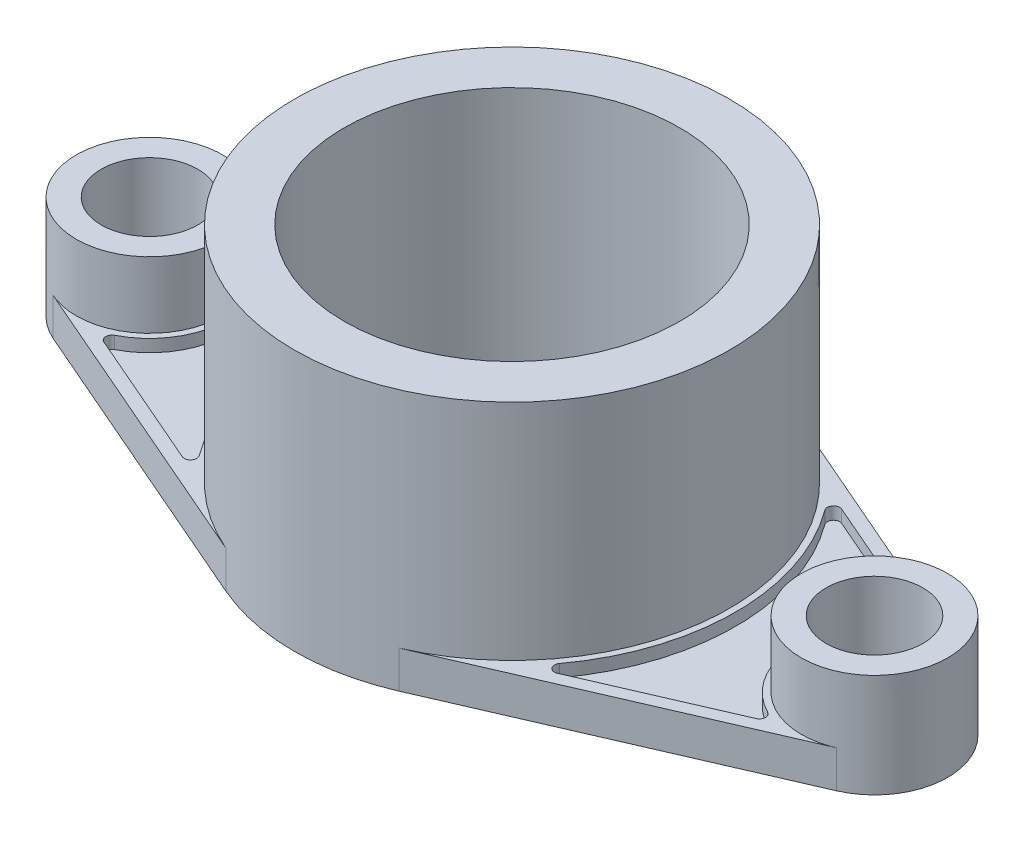
ISO-10303-21;
HEADER;
FILE_DESCRIPTION(('STEP AP214'),'2;1');
FILE_NAME('part.step','',(''),(''),'','','');
FILE_SCHEMA(('AUTOMOTIVE_DESIGN { 1 0 10303 214 1 1 1 1 }'));
ENDSEC;
DATA;
#1=APPLICATION_CONTEXT('core data for automotive mechanical design processes');
#2=APPLICATION_PROTOCOL_DEFINITION('international standard','automotive_design',2000,#1);
#3=PRODUCT_CONTEXT('',#1,'mechanical');
#4=PRODUCT('Part','Part','',(#3));
#5=PRODUCT_RELATED_PRODUCT_CATEGORY('part','',(#4));
#6=PRODUCT_DEFINITION_FORMATION('','',#4);
#7=PRODUCT_DEFINITION_CONTEXT('part definition',#1,'design');
#8=PRODUCT_DEFINITION('design','',#6,#7);
#9=PRODUCT_DEFINITION_SHAPE('','',#8);
#10=(LENGTH_UNIT() NAMED_UNIT(*) SI_UNIT(.MILLI.,.METRE.));
#11=(NAMED_UNIT(*) PLANE_ANGLE_UNIT() SI_UNIT($,.RADIAN.));
#12=(NAMED_UNIT(*) SI_UNIT($,.STERADIAN.) SOLID_ANGLE_UNIT());
#13=UNCERTAINTY_MEASURE_WITH_UNIT(LENGTH_MEASURE(1.E-05),#10,'distance_accuracy_value','');
#14=(GEOMETRIC_REPRESENTATION_CONTEXT(3) GLOBAL_UNCERTAINTY_ASSIGNED_CONTEXT((#13)) GLOBAL_UNIT_ASSIGNED_CONTEXT((#10,
#11,#12)) REPRESENTATION_CONTEXT('',''));
#15=CARTESIAN_POINT('',(0.,0.,0.));
#16=DIRECTION('',(0.,0.,1.));
#17=DIRECTION('',(1.,0.,0.));
#18=AXIS2_PLACEMENT_3D('',#15,#16,#17);
#19=CARTESIAN_POINT('',(87.5,9.,0.));
#20=DIRECTION('',(0.,-1.,0.));
#21=DIRECTION('',(0.,0.,-1.));
#22=AXIS2_PLACEMENT_3D('',#19,#20,#21);
#23=PLANE('',#22);
#24=CARTESIAN_POINT('',(87.5,9.,0.));
#25=DIRECTION('',(0.,1.,0.));
#26=DIRECTION('',(0.,0.,-1.));
#27=AXIS2_PLACEMENT_3D('',#24,#25,#26);
#28=CIRCLE('',#27,17.665);
#29=CARTESIAN_POINT('',(94.5326888571428,9.,-16.204737345561));
#30=VERTEX_POINT('',#29);
#31=CARTESIAN_POINT('',(94.5326888571429,9.,16.2047373455609));
#32=VERTEX_POINT('',#31);
#33=EDGE_CURVE('E354',#30,#32,#28,.T.);
#34=ORIENTED_EDGE('',*,*,#33,.F.);
#35=DIRECTION('',(0.917335824826549,0.,0.398114285714285));
#36=VECTOR('',#35,1.);
#37=CARTESIAN_POINT('',(94.5326888571428,9.,-16.204737345561));
#38=LINE('',#37,#36);
#39=CARTESIAN_POINT('',(20.901,9.,-48.1601308033938));
#40=VERTEX_POINT('',#39);
#41=EDGE_CURVE('E363',#40,#30,#38,.T.);
#42=ORIENTED_EDGE('',*,*,#41,.F.);
#43=CARTESIAN_POINT('',(0.,9.,0.));
#44=DIRECTION('',(0.,1.,0.));
#45=DIRECTION('',(0.,0.,-1.));
#46=AXIS2_PLACEMENT_3D('',#43,#44,#45);
#47=CIRCLE('',#46,52.5);
#48=CARTESIAN_POINT('',(20.901,9.,48.1601308033938));
#49=VERTEX_POINT('',#48);
#50=EDGE_CURVE('E361',#49,#40,#47,.T.);
#51=ORIENTED_EDGE('',*,*,#50,.F.);
#52=DIRECTION('',(-0.917335824826548,0.,0.398114285714286));
#53=VECTOR('',#52,1.);
#54=CARTESIAN_POINT('',(94.5326888571429,9.,16.204737345561));
#55=LINE('',#54,#53);
#56=EDGE_CURVE('E357',#32,#49,#55,.T.);
#57=ORIENTED_EDGE('',*,*,#56,.F.);
#58=EDGE_LOOP('',(#34,#42,#51,#57));
#59=FACE_BOUND('',#58,.T.);
#60=CARTESIAN_POINT('',(87.5,9.,0.));
#61=DIRECTION('',(0.,-1.,0.));
#62=DIRECTION('',(0.,0.,-1.));
#63=AXIS2_PLACEMENT_3D('',#60,#61,#62);
#64=CIRCLE('',#63,19.165);
#65=CARTESIAN_POINT('',(78.8093599511355,9.,-17.0812763147568));
#66=VERTEX_POINT('',#65);
#67=CARTESIAN_POINT('',(78.8093599511355,9.,17.0812763147568));
#68=VERTEX_POINT('',#67);
#69=EDGE_CURVE('E414',#66,#68,#64,.F.);
#70=ORIENTED_EDGE('',*,*,#69,.T.);
#71=CARTESIAN_POINT('',(78.1291637563379,9.,18.4181881056327));
#72=DIRECTION('',(0.,-1.,0.));
#73=DIRECTION('',(0.,0.,-1.));
#74=AXIS2_PLACEMENT_3D('',#71,#72,#73);
#75=CIRCLE('',#74,1.5);
#76=CARTESIAN_POINT('',(78.7263351849093,9.,19.7941918428725));
#77=VERTEX_POINT('',#76);
#78=EDGE_CURVE('E11',#68,#77,#75,.T.);
#79=ORIENTED_EDGE('',*,*,#78,.T.);
#80=DIRECTION('',(-0.917335824826549,0.,0.398114285714286));
#81=VECTOR('',#80,1.);
#82=CARTESIAN_POINT('',(93.338346,9.,13.4527298710813));
#83=LINE('',#82,#81);
#84=CARTESIAN_POINT('',(45.2647922135112,9.,34.316156338781));
#85=VERTEX_POINT('',#84);
#86=EDGE_CURVE('E47',#77,#85,#83,.T.);
#87=ORIENTED_EDGE('',*,*,#86,.T.);
#88=CARTESIAN_POINT('',(44.6676207849397,9.,32.9401526015412));
#89=DIRECTION('',(0.,-1.,0.));
#90=DIRECTION('',(0.,0.,-1.));
#91=AXIS2_PLACEMENT_3D('',#88,#89,#90);
#92=CIRCLE('',#91,1.5);
#93=CARTESIAN_POINT('',(43.4603877907522,9.,32.0498782069049));
#94=VERTEX_POINT('',#93);
#95=EDGE_CURVE('E429',#85,#94,#92,.T.);
#96=ORIENTED_EDGE('',*,*,#95,.T.);
#97=CARTESIAN_POINT('',(0.,9.,0.));
#98=DIRECTION('',(0.,-1.,0.));
#99=DIRECTION('',(0.,0.,-1.));
#100=AXIS2_PLACEMENT_3D('',#97,#98,#99);
#101=CIRCLE('',#100,54.);
#102=CARTESIAN_POINT('',(43.4603877907522,9.,-32.0498782069049));
#103=VERTEX_POINT('',#102);
#104=EDGE_CURVE('E426',#94,#103,#101,.F.);
#105=ORIENTED_EDGE('',*,*,#104,.T.);
#106=CARTESIAN_POINT('',(44.6676207849397,9.,-32.9401526015412));
#107=DIRECTION('',(0.,-1.,0.));
#108=DIRECTION('',(0.,0.,-1.));
#109=AXIS2_PLACEMENT_3D('',#106,#107,#108);
#110=CIRCLE('',#109,1.5);
#111=CARTESIAN_POINT('',(45.2647922135112,9.,-34.316156338781));
#112=VERTEX_POINT('',#111);
#113=EDGE_CURVE('E423',#103,#112,#110,.T.);
#114=ORIENTED_EDGE('',*,*,#113,.T.);
#115=DIRECTION('',(0.917335824826549,0.,0.398114285714286));
#116=VECTOR('',#115,1.);
#117=CARTESIAN_POINT('',(93.338346,9.,-13.4527298710813));
#118=LINE('',#117,#116);
#119=CARTESIAN_POINT('',(78.7263351849093,9.,-19.7941918428725));
#120=VERTEX_POINT('',#119);
#121=EDGE_CURVE('E420',#112,#120,#118,.T.);
#122=ORIENTED_EDGE('',*,*,#121,.T.);
#123=CARTESIAN_POINT('',(78.1291637563379,9.,-18.4181881056327));
#124=DIRECTION('',(0.,-1.,0.));
#125=DIRECTION('',(0.,0.,-1.));
#126=AXIS2_PLACEMENT_3D('',#123,#124,#125);
#127=CIRCLE('',#126,1.5);
#128=EDGE_CURVE('E417',#120,#66,#127,.T.);
#129=ORIENTED_EDGE('',*,*,#128,.T.);
#130=EDGE_LOOP('',(#70,#79,#87,#96,#105,#114,#122,#129));
#131=FACE_BOUND('',#130,.T.);
#132=ADVANCED_FACE('F39',(#59,#131),#23,.F.);
#133=CARTESIAN_POINT('',(0.,63.,0.));
#134=DIRECTION('',(0.,1.,0.));
#135=DIRECTION('',(0.,0.,1.));
#136=AXIS2_PLACEMENT_3D('',#133,#134,#135);
#137=PLANE('',#136);
#138=CARTESIAN_POINT('',(0.,63.,0.));
#139=DIRECTION('',(0.,1.,0.));
#140=DIRECTION('',(0.,0.,1.));
#141=AXIS2_PLACEMENT_3D('',#138,#139,#140);
#142=CIRCLE('',#141,52.5);
#143=CARTESIAN_POINT('',(0.,63.,52.5));
#144=VERTEX_POINT('',#143);
#145=EDGE_CURVE('E388',#144,#144,#142,.T.);
#146=ORIENTED_EDGE('',*,*,#145,.T.);
#147=EDGE_LOOP('',(#146));
#148=FACE_BOUND('',#147,.T.);
#149=CARTESIAN_POINT('',(0.,63.,0.));
#150=DIRECTION('',(0.,1.,0.));
#151=DIRECTION('',(0.,0.,1.));
#152=AXIS2_PLACEMENT_3D('',#149,#150,#151);
#153=CIRCLE('',#152,40.5);
#154=CARTESIAN_POINT('',(0.,63.,40.5));
#155=VERTEX_POINT('',#154);
#156=EDGE_CURVE('E382',#155,#155,#153,.T.);
#157=ORIENTED_EDGE('',*,*,#156,.F.);
#158=EDGE_LOOP('',(#157));
#159=FACE_BOUND('',#158,.T.);
#160=ADVANCED_FACE('F467',(#148,#159),#137,.T.);
#161=CARTESIAN_POINT('',(0.,0.,0.));
#162=DIRECTION('',(0.,1.,0.));
#163=DIRECTION('',(0.,0.,1.));
#164=AXIS2_PLACEMENT_3D('',#161,#162,#163);
#165=PLANE('',#164);
#166=CARTESIAN_POINT('',(0.,0.,0.));
#167=DIRECTION('',(0.,1.,0.));
#168=DIRECTION('',(0.,0.,1.));
#169=AXIS2_PLACEMENT_3D('',#166,#167,#168);
#170=CIRCLE('',#169,52.5);
#171=CARTESIAN_POINT('',(20.901,0.,-48.1601308033938));
#172=VERTEX_POINT('',#171);
#173=CARTESIAN_POINT('',(-20.901,0.,-48.1601308033938));
#174=VERTEX_POINT('',#173);
#175=EDGE_CURVE('E392',#172,#174,#170,.T.);
#176=ORIENTED_EDGE('',*,*,#175,.F.);
#177=DIRECTION('',(0.917335824826549,0.,0.398114285714285));
#178=VECTOR('',#177,1.);
#179=CARTESIAN_POINT('',(94.5326888571428,0.,-16.204737345561));
#180=LINE('',#179,#178);
#181=CARTESIAN_POINT('',(94.5326888571428,0.,-16.204737345561));
#182=VERTEX_POINT('',#181);
#183=EDGE_CURVE('E358',#172,#182,#180,.T.);
#184=ORIENTED_EDGE('',*,*,#183,.T.);
#185=CARTESIAN_POINT('',(87.5,0.,0.));
#186=DIRECTION('',(0.,1.,0.));
#187=DIRECTION('',(0.,0.,1.));
#188=AXIS2_PLACEMENT_3D('',#185,#186,#187);
#189=CIRCLE('',#188,17.665);
#190=CARTESIAN_POINT('',(94.5326888571429,0.,16.204737345561));
#191=VERTEX_POINT('',#190);
#192=EDGE_CURVE('E348',#191,#182,#189,.T.);
#193=ORIENTED_EDGE('',*,*,#192,.F.);
#194=DIRECTION('',(-0.917335824826548,0.,0.398114285714286));
#195=VECTOR('',#194,1.);
#196=CARTESIAN_POINT('',(94.5326888571429,0.,16.204737345561));
#197=LINE('',#196,#195);
#198=CARTESIAN_POINT('',(20.901,0.,48.1601308033938));
#199=VERTEX_POINT('',#198);
#200=EDGE_CURVE('E351',#191,#199,#197,.T.);
#201=ORIENTED_EDGE('',*,*,#200,.T.);
#202=CARTESIAN_POINT('',(-20.901,0.,48.1601308033938));
#203=VERTEX_POINT('',#202);
#204=EDGE_CURVE('E385',#203,#199,#170,.T.);
#205=ORIENTED_EDGE('',*,*,#204,.F.);
#206=DIRECTION('',(-0.917335824826549,0.,-0.398114285714286));
#207=VECTOR('',#206,1.);
#208=CARTESIAN_POINT('',(-94.5326888571429,0.,16.204737345561));
#209=LINE('',#208,#207);
#210=CARTESIAN_POINT('',(-94.5326888571429,0.,16.204737345561));
#211=VERTEX_POINT('',#210);
#212=EDGE_CURVE('E325',#203,#211,#209,.T.);
#213=ORIENTED_EDGE('',*,*,#212,.T.);
#214=CARTESIAN_POINT('',(-87.5,0.,0.));
#215=DIRECTION('',(0.,1.,0.));
#216=DIRECTION('',(0.,0.,1.));
#217=AXIS2_PLACEMENT_3D('',#214,#215,#216);
#218=CIRCLE('',#217,17.665);
#219=CARTESIAN_POINT('',(-94.5326888571428,0.,-16.204737345561));
#220=VERTEX_POINT('',#219);
#221=EDGE_CURVE('E243',#220,#211,#218,.T.);
#222=ORIENTED_EDGE('',*,*,#221,.F.);
#223=DIRECTION('',(0.917335824826548,0.,-0.398114285714286));
#224=VECTOR('',#223,1.);
#225=CARTESIAN_POINT('',(-20.901,0.,-48.1601308033938));
#226=LINE('',#225,#224);
#227=EDGE_CURVE('E328',#220,#174,#226,.T.);
#228=ORIENTED_EDGE('',*,*,#227,.T.);
#229=EDGE_LOOP('',(#176,#184,#193,#201,#205,#213,#222,#228));
#230=FACE_BOUND('',#229,.T.);
#231=CARTESIAN_POINT('',(0.,0.,0.));
#232=DIRECTION('',(0.,1.,0.));
#233=DIRECTION('',(0.,0.,1.));
#234=AXIS2_PLACEMENT_3D('',#231,#232,#233);
#235=CIRCLE('',#234,40.5);
#236=CARTESIAN_POINT('',(0.,0.,40.5));
#237=VERTEX_POINT('',#236);
#238=EDGE_CURVE('E373',#237,#237,#235,.T.);
#239=ORIENTED_EDGE('',*,*,#238,.T.);
#240=EDGE_LOOP('',(#239));
#241=FACE_BOUND('',#240,.T.);
#242=CARTESIAN_POINT('',(87.5,0.,0.));
#243=DIRECTION('',(0.,1.,0.));
#244=DIRECTION('',(0.,0.,1.));
#245=AXIS2_PLACEMENT_3D('',#242,#243,#244);
#246=CIRCLE('',#245,11.665);
#247=CARTESIAN_POINT('',(87.5,0.,11.665));
#248=VERTEX_POINT('',#247);
#249=EDGE_CURVE('E342',#248,#248,#246,.T.);
#250=ORIENTED_EDGE('',*,*,#249,.T.);
#251=EDGE_LOOP('',(#250));
#252=FACE_BOUND('',#251,.T.);
#253=CARTESIAN_POINT('',(-87.5,0.,0.));
#254=DIRECTION('',(0.,1.,0.));
#255=DIRECTION('',(0.,0.,1.));
#256=AXIS2_PLACEMENT_3D('',#253,#254,#255);
#257=CIRCLE('',#256,11.665);
#258=CARTESIAN_POINT('',(-87.5,0.,11.665));
#259=VERTEX_POINT('',#258);
#260=EDGE_CURVE('E305',#259,#259,#257,.T.);
#261=ORIENTED_EDGE('',*,*,#260,.T.);
#262=EDGE_LOOP('',(#261));
#263=FACE_BOUND('',#262,.T.);
#264=ADVANCED_FACE('F475',(#230,#241,#252,#263),#165,.F.);
#265=CARTESIAN_POINT('',(0.,63.,0.));
#266=DIRECTION('',(0.,-1.,0.));
#267=DIRECTION('',(0.,0.,-1.));
#268=AXIS2_PLACEMENT_3D('',#265,#266,#267);
#269=CYLINDRICAL_SURFACE('',#268,52.5);
#270=CARTESIAN_POINT('',(0.,9.,0.));
#271=DIRECTION('',(0.,1.,0.));
#272=DIRECTION('',(0.,0.,-1.));
#273=AXIS2_PLACEMENT_3D('',#270,#271,#272);
#274=CIRCLE('',#273,52.5);
#275=CARTESIAN_POINT('',(-20.901,9.,-48.1601308033938));
#276=VERTEX_POINT('',#275);
#277=CARTESIAN_POINT('',(-20.901,9.,48.1601308033938));
#278=VERTEX_POINT('',#277);
#279=EDGE_CURVE('E335',#276,#278,#274,.T.);
#280=ORIENTED_EDGE('',*,*,#279,.T.);
#281=DIRECTION('',(0.,-1.,0.));
#282=VECTOR('',#281,1.);
#283=CARTESIAN_POINT('',(-20.901,9.,48.1601308033938));
#284=LINE('',#283,#282);
#285=EDGE_CURVE('E321',#278,#203,#284,.T.);
#286=ORIENTED_EDGE('',*,*,#285,.T.);
#287=ORIENTED_EDGE('',*,*,#204,.T.);
#288=DIRECTION('',(0.,-1.,0.));
#289=VECTOR('',#288,1.);
#290=CARTESIAN_POINT('',(20.901,9.,48.1601308033938));
#291=LINE('',#290,#289);
#292=EDGE_CURVE('E377',#49,#199,#291,.T.);
#293=ORIENTED_EDGE('',*,*,#292,.F.);
#294=ORIENTED_EDGE('',*,*,#50,.T.);
#295=DIRECTION('',(0.,-1.,0.));
#296=VECTOR('',#295,1.);
#297=CARTESIAN_POINT('',(20.901,9.,-48.1601308033938));
#298=LINE('',#297,#296);
#299=EDGE_CURVE('E374',#40,#172,#298,.T.);
#300=ORIENTED_EDGE('',*,*,#299,.T.);
#301=ORIENTED_EDGE('',*,*,#175,.T.);
#302=DIRECTION('',(0.,-1.,0.));
#303=VECTOR('',#302,1.);
#304=CARTESIAN_POINT('',(-20.901,9.,-48.1601308033938));
#305=LINE('',#304,#303);
#306=EDGE_CURVE('E318',#276,#174,#305,.T.);
#307=ORIENTED_EDGE('',*,*,#306,.F.);
#308=EDGE_LOOP('',(#280,#286,#287,#293,#294,#300,#301,#307));
#309=FACE_BOUND('',#308,.T.);
#310=ORIENTED_EDGE('',*,*,#145,.F.);
#311=EDGE_LOOP('',(#310));
#312=FACE_BOUND('',#311,.T.);
#313=ADVANCED_FACE('F41',(#309,#312),#269,.T.);
#314=CARTESIAN_POINT('',(0.,63.,0.));
#315=DIRECTION('',(0.,-1.,0.));
#316=DIRECTION('',(0.,0.,-1.));
#317=AXIS2_PLACEMENT_3D('',#314,#315,#316);
#318=CYLINDRICAL_SURFACE('',#317,40.5);
#319=ORIENTED_EDGE('',*,*,#156,.T.);
#320=EDGE_LOOP('',(#319));
#321=FACE_BOUND('',#320,.T.);
#322=ORIENTED_EDGE('',*,*,#238,.F.);
#323=EDGE_LOOP('',(#322));
#324=FACE_BOUND('',#323,.T.);
#325=ADVANCED_FACE('F486',(#321,#324),#318,.F.);
#326=CARTESIAN_POINT('',(94.5326888571428,9.,-16.204737345561));
#327=DIRECTION('',(0.398114285714285,0.,-0.917335824826549));
#328=DIRECTION('',(-0.917335824826549,0.,-0.398114285714285));
#329=AXIS2_PLACEMENT_3D('',#326,#327,#328);
#330=PLANE('',#329);
#331=ORIENTED_EDGE('',*,*,#183,.F.);
#332=ORIENTED_EDGE('',*,*,#299,.F.);
#333=ORIENTED_EDGE('',*,*,#41,.T.);
#334=DIRECTION('',(0.,-1.,0.));
#335=VECTOR('',#334,1.);
#336=CARTESIAN_POINT('',(94.5326888571428,9.,-16.204737345561));
#337=LINE('',#336,#335);
#338=EDGE_CURVE('E371',#30,#182,#337,.T.);
#339=ORIENTED_EDGE('',*,*,#338,.T.);
#340=EDGE_LOOP('',(#331,#332,#333,#339));
#341=FACE_BOUND('',#340,.T.);
#342=ADVANCED_FACE('F482',(#341),#330,.T.);
#343=CARTESIAN_POINT('',(94.5326888571429,9.,16.204737345561));
#344=DIRECTION('',(0.398114285714286,0.,0.917335824826548));
#345=DIRECTION('',(0.917335824826548,0.,-0.398114285714286));
#346=AXIS2_PLACEMENT_3D('',#343,#344,#345);
#347=PLANE('',#346);
#348=ORIENTED_EDGE('',*,*,#200,.F.);
#349=DIRECTION('',(0.,-1.,0.));
#350=VECTOR('',#349,1.);
#351=CARTESIAN_POINT('',(94.5326888571429,9.,16.204737345561));
#352=LINE('',#351,#350);
#353=EDGE_CURVE('E366',#32,#191,#352,.T.);
#354=ORIENTED_EDGE('',*,*,#353,.F.);
#355=ORIENTED_EDGE('',*,*,#56,.T.);
#356=ORIENTED_EDGE('',*,*,#292,.T.);
#357=EDGE_LOOP('',(#348,#354,#355,#356));
#358=FACE_BOUND('',#357,.T.);
#359=ADVANCED_FACE('F485',(#358),#347,.T.);
#360=CARTESIAN_POINT('',(87.5,0.,0.));
#361=DIRECTION('',(0.,1.,0.));
#362=DIRECTION('',(0.,0.,1.));
#363=AXIS2_PLACEMENT_3D('',#360,#361,#362);
#364=CYLINDRICAL_SURFACE('',#363,17.665);
#365=ORIENTED_EDGE('',*,*,#192,.T.);
#366=ORIENTED_EDGE('',*,*,#338,.F.);
#367=ORIENTED_EDGE('',*,*,#33,.T.);
#368=ORIENTED_EDGE('',*,*,#353,.T.);
#369=EDGE_LOOP('',(#365,#366,#367,#368));
#370=FACE_BOUND('',#369,.T.);
#371=CARTESIAN_POINT('',(87.5,25.,0.));
#372=DIRECTION('',(0.,1.,0.));
#373=DIRECTION('',(0.,0.,1.));
#374=AXIS2_PLACEMENT_3D('',#371,#372,#373);
#375=CIRCLE('',#374,17.665);
#376=CARTESIAN_POINT('',(87.5,25.,17.665));
#377=VERTEX_POINT('',#376);
#378=EDGE_CURVE('E345',#377,#377,#375,.T.);
#379=ORIENTED_EDGE('',*,*,#378,.F.);
#380=EDGE_LOOP('',(#379));
#381=FACE_BOUND('',#380,.T.);
#382=ADVANCED_FACE('F480',(#370,#381),#364,.T.);
#383=CARTESIAN_POINT('',(87.5,25.,0.));
#384=DIRECTION('',(0.,1.,0.));
#385=DIRECTION('',(0.,0.,1.));
#386=AXIS2_PLACEMENT_3D('',#383,#384,#385);
#387=PLANE('',#386);
#388=CARTESIAN_POINT('',(87.5,25.,0.));
#389=DIRECTION('',(0.,1.,0.));
#390=DIRECTION('',(0.,0.,1.));
#391=AXIS2_PLACEMENT_3D('',#388,#389,#390);
#392=CIRCLE('',#391,11.665);
#393=CARTESIAN_POINT('',(87.5,25.,11.665));
#394=VERTEX_POINT('',#393);
#395=EDGE_CURVE('E332',#394,#394,#392,.T.);
#396=ORIENTED_EDGE('',*,*,#395,.F.);
#397=EDGE_LOOP('',(#396));
#398=FACE_BOUND('',#397,.T.);
#399=ORIENTED_EDGE('',*,*,#378,.T.);
#400=EDGE_LOOP('',(#399));
#401=FACE_BOUND('',#400,.T.);
#402=ADVANCED_FACE('F538',(#398,#401),#387,.T.);
#403=CARTESIAN_POINT('',(87.5,0.,0.));
#404=DIRECTION('',(0.,1.,0.));
#405=DIRECTION('',(0.,0.,1.));
#406=AXIS2_PLACEMENT_3D('',#403,#404,#405);
#407=CYLINDRICAL_SURFACE('',#406,11.665);
#408=ORIENTED_EDGE('',*,*,#249,.F.);
#409=EDGE_LOOP('',(#408));
#410=FACE_BOUND('',#409,.T.);
#411=ORIENTED_EDGE('',*,*,#395,.T.);
#412=EDGE_LOOP('',(#411));
#413=FACE_BOUND('',#412,.T.);
#414=ADVANCED_FACE('F534',(#410,#413),#407,.F.);
#415=CARTESIAN_POINT('',(-94.5326888571429,9.,16.204737345561));
#416=DIRECTION('',(-0.398114285714286,0.,0.917335824826549));
#417=DIRECTION('',(0.917335824826549,0.,0.398114285714286));
#418=AXIS2_PLACEMENT_3D('',#415,#416,#417);
#419=PLANE('',#418);
#420=ORIENTED_EDGE('',*,*,#212,.F.);
#421=ORIENTED_EDGE('',*,*,#285,.F.);
#422=DIRECTION('',(-0.917335824826549,0.,-0.398114285714286));
#423=VECTOR('',#422,1.);
#424=CARTESIAN_POINT('',(-94.5326888571429,9.,16.204737345561));
#425=LINE('',#424,#423);
#426=CARTESIAN_POINT('',(-94.5326888571429,9.,16.204737345561));
#427=VERTEX_POINT('',#426);
#428=EDGE_CURVE('E317',#278,#427,#425,.T.);
#429=ORIENTED_EDGE('',*,*,#428,.T.);
#430=DIRECTION('',(0.,-1.,0.));
#431=VECTOR('',#430,1.);
#432=CARTESIAN_POINT('',(-94.5326888571429,9.,16.204737345561));
#433=LINE('',#432,#431);
#434=EDGE_CURVE('E311',#427,#211,#433,.T.);
#435=ORIENTED_EDGE('',*,*,#434,.T.);
#436=EDGE_LOOP('',(#420,#421,#429,#435));
#437=FACE_BOUND('',#436,.T.);
#438=ADVANCED_FACE('F531',(#437),#419,.T.);
#439=CARTESIAN_POINT('',(-20.901,9.,-48.1601308033938));
#440=DIRECTION('',(-0.398114285714286,0.,-0.917335824826548));
#441=DIRECTION('',(-0.917335824826548,0.,0.398114285714286));
#442=AXIS2_PLACEMENT_3D('',#439,#440,#441);
#443=PLANE('',#442);
#444=ORIENTED_EDGE('',*,*,#227,.F.);
#445=DIRECTION('',(0.,-1.,0.));
#446=VECTOR('',#445,1.);
#447=CARTESIAN_POINT('',(-94.5326888571428,9.,-16.204737345561));
#448=LINE('',#447,#446);
#449=CARTESIAN_POINT('',(-94.5326888571428,9.,-16.204737345561));
#450=VERTEX_POINT('',#449);
#451=EDGE_CURVE('E314',#450,#220,#448,.T.);
#452=ORIENTED_EDGE('',*,*,#451,.F.);
#453=DIRECTION('',(0.917335824826548,0.,-0.398114285714286));
#454=VECTOR('',#453,1.);
#455=CARTESIAN_POINT('',(-20.901,9.,-48.1601308033938));
#456=LINE('',#455,#454);
#457=EDGE_CURVE('E337',#450,#276,#456,.T.);
#458=ORIENTED_EDGE('',*,*,#457,.T.);
#459=ORIENTED_EDGE('',*,*,#306,.T.);
#460=EDGE_LOOP('',(#444,#452,#458,#459));
#461=FACE_BOUND('',#460,.T.);
#462=ADVANCED_FACE('F525',(#461),#443,.T.);
#463=CARTESIAN_POINT('',(-87.5,9.,0.));
#464=DIRECTION('',(0.,-1.,0.));
#465=DIRECTION('',(0.,0.,-1.));
#466=AXIS2_PLACEMENT_3D('',#463,#464,#465);
#467=PLANE('',#466);
#468=DIRECTION('',(0.917335824826549,0.,-0.398114285714286));
#469=VECTOR('',#468,1.);
#470=CARTESIAN_POINT('',(-93.338346,9.,-13.4527298710813));
#471=LINE('',#470,#469);
#472=CARTESIAN_POINT('',(-78.7263351849093,9.,-19.7941918428725));
#473=VERTEX_POINT('',#472);
#474=CARTESIAN_POINT('',(-45.2647922135112,9.,-34.316156338781));
#475=VERTEX_POINT('',#474);
#476=EDGE_CURVE('E391',#473,#475,#471,.T.);
#477=ORIENTED_EDGE('',*,*,#476,.T.);
#478=CARTESIAN_POINT('',(-44.6676207849397,9.,-32.9401526015412));
#479=DIRECTION('',(0.,-1.,0.));
#480=DIRECTION('',(0.,0.,-1.));
#481=AXIS2_PLACEMENT_3D('',#478,#479,#480);
#482=CIRCLE('',#481,1.5);
#483=CARTESIAN_POINT('',(-43.4603877907522,9.,-32.0498782069049));
#484=VERTEX_POINT('',#483);
#485=EDGE_CURVE('E205',#475,#484,#482,.T.);
#486=ORIENTED_EDGE('',*,*,#485,.T.);
#487=CARTESIAN_POINT('',(0.,9.,0.));
#488=DIRECTION('',(0.,-1.,0.));
#489=DIRECTION('',(0.,0.,-1.));
#490=AXIS2_PLACEMENT_3D('',#487,#488,#489);
#491=CIRCLE('',#490,54.);
#492=CARTESIAN_POINT('',(-43.4603877907522,9.,32.0498782069049));
#493=VERTEX_POINT('',#492);
#494=EDGE_CURVE('E410',#484,#493,#491,.F.);
#495=ORIENTED_EDGE('',*,*,#494,.T.);
#496=CARTESIAN_POINT('',(-44.6676207849397,9.,32.9401526015412));
#497=DIRECTION('',(0.,-1.,0.));
#498=DIRECTION('',(0.,0.,-1.));
#499=AXIS2_PLACEMENT_3D('',#496,#497,#498);
#500=CIRCLE('',#499,1.5);
#501=CARTESIAN_POINT('',(-45.2647922135112,9.,34.316156338781));
#502=VERTEX_POINT('',#501);
#503=EDGE_CURVE('E407',#493,#502,#500,.T.);
#504=ORIENTED_EDGE('',*,*,#503,.T.);
#505=DIRECTION('',(-0.917335824826549,0.,-0.398114285714286));
#506=VECTOR('',#505,1.);
#507=CARTESIAN_POINT('',(-93.338346,9.,13.4527298710813));
#508=LINE('',#507,#506);
#509=CARTESIAN_POINT('',(-78.7263351849093,9.,19.7941918428725));
#510=VERTEX_POINT('',#509);
#511=EDGE_CURVE('E404',#502,#510,#508,.T.);
#512=ORIENTED_EDGE('',*,*,#511,.T.);
#513=CARTESIAN_POINT('',(-78.1291637563379,9.,18.4181881056327));
#514=DIRECTION('',(0.,-1.,0.));
#515=DIRECTION('',(0.,0.,-1.));
#516=AXIS2_PLACEMENT_3D('',#513,#514,#515);
#517=CIRCLE('',#516,1.5);
#518=CARTESIAN_POINT('',(-78.8093599511355,9.,17.0812763147568));
#519=VERTEX_POINT('',#518);
#520=EDGE_CURVE('E401',#510,#519,#517,.T.);
#521=ORIENTED_EDGE('',*,*,#520,.T.);
#522=CARTESIAN_POINT('',(-87.5,9.,0.));
#523=DIRECTION('',(0.,-1.,0.));
#524=DIRECTION('',(0.,0.,-1.));
#525=AXIS2_PLACEMENT_3D('',#522,#523,#524);
#526=CIRCLE('',#525,19.165);
#527=CARTESIAN_POINT('',(-78.8093599511355,9.,-17.0812763147568));
#528=VERTEX_POINT('',#527);
#529=EDGE_CURVE('E398',#519,#528,#526,.F.);
#530=ORIENTED_EDGE('',*,*,#529,.T.);
#531=CARTESIAN_POINT('',(-78.1291637563379,9.,-18.4181881056327));
#532=DIRECTION('',(0.,-1.,0.));
#533=DIRECTION('',(0.,0.,-1.));
#534=AXIS2_PLACEMENT_3D('',#531,#532,#533);
#535=CIRCLE('',#534,1.5);
#536=EDGE_CURVE('E395',#528,#473,#535,.T.);
#537=ORIENTED_EDGE('',*,*,#536,.T.);
#538=EDGE_LOOP('',(#477,#486,#495,#504,#512,#521,#530,#537));
#539=FACE_BOUND('',#538,.T.);
#540=CARTESIAN_POINT('',(-87.5,9.,0.));
#541=DIRECTION('',(0.,1.,0.));
#542=DIRECTION('',(0.,0.,-1.));
#543=AXIS2_PLACEMENT_3D('',#540,#541,#542);
#544=CIRCLE('',#543,17.665);
#545=EDGE_CURVE('E329',#427,#450,#544,.T.);
#546=ORIENTED_EDGE('',*,*,#545,.F.);
#547=ORIENTED_EDGE('',*,*,#428,.F.);
#548=ORIENTED_EDGE('',*,*,#279,.F.);
#549=ORIENTED_EDGE('',*,*,#457,.F.);
#550=EDGE_LOOP('',(#546,#547,#548,#549));
#551=FACE_BOUND('',#550,.T.);
#552=ADVANCED_FACE('F519',(#539,#551),#467,.F.);
#553=CARTESIAN_POINT('',(-87.5,0.,0.));
#554=DIRECTION('',(0.,1.,0.));
#555=DIRECTION('',(0.,0.,1.));
#556=AXIS2_PLACEMENT_3D('',#553,#554,#555);
#557=CYLINDRICAL_SURFACE('',#556,17.665);
#558=ORIENTED_EDGE('',*,*,#221,.T.);
#559=ORIENTED_EDGE('',*,*,#434,.F.);
#560=ORIENTED_EDGE('',*,*,#545,.T.);
#561=ORIENTED_EDGE('',*,*,#451,.T.);
#562=EDGE_LOOP('',(#558,#559,#560,#561));
#563=FACE_BOUND('',#562,.T.);
#564=CARTESIAN_POINT('',(-87.5,25.,0.));
#565=DIRECTION('',(0.,1.,0.));
#566=DIRECTION('',(0.,0.,1.));
#567=AXIS2_PLACEMENT_3D('',#564,#565,#566);
#568=CIRCLE('',#567,17.665);
#569=CARTESIAN_POINT('',(-87.5,25.,17.665));
#570=VERTEX_POINT('',#569);
#571=EDGE_CURVE('E302',#570,#570,#568,.T.);
#572=ORIENTED_EDGE('',*,*,#571,.F.);
#573=EDGE_LOOP('',(#572));
#574=FACE_BOUND('',#573,.T.);
#575=ADVANCED_FACE('F514',(#563,#574),#557,.T.);
#576=CARTESIAN_POINT('',(-87.5,25.,0.));
#577=DIRECTION('',(0.,1.,0.));
#578=DIRECTION('',(0.,0.,1.));
#579=AXIS2_PLACEMENT_3D('',#576,#577,#578);
#580=PLANE('',#579);
#581=CARTESIAN_POINT('',(-87.5,25.,0.));
#582=DIRECTION('',(0.,1.,0.));
#583=DIRECTION('',(0.,0.,1.));
#584=AXIS2_PLACEMENT_3D('',#581,#582,#583);
#585=CIRCLE('',#584,11.665);
#586=CARTESIAN_POINT('',(-87.5,25.,11.665));
#587=VERTEX_POINT('',#586);
#588=EDGE_CURVE('E308',#587,#587,#585,.T.);
#589=ORIENTED_EDGE('',*,*,#588,.F.);
#590=EDGE_LOOP('',(#589));
#591=FACE_BOUND('',#590,.T.);
#592=ORIENTED_EDGE('',*,*,#571,.T.);
#593=EDGE_LOOP('',(#592));
#594=FACE_BOUND('',#593,.T.);
#595=ADVANCED_FACE('F508',(#591,#594),#580,.T.);
#596=CARTESIAN_POINT('',(-87.5,0.,0.));
#597=DIRECTION('',(0.,1.,0.));
#598=DIRECTION('',(0.,0.,1.));
#599=AXIS2_PLACEMENT_3D('',#596,#597,#598);
#600=CYLINDRICAL_SURFACE('',#599,11.665);
#601=ORIENTED_EDGE('',*,*,#260,.F.);
#602=EDGE_LOOP('',(#601));
#603=FACE_BOUND('',#602,.T.);
#604=ORIENTED_EDGE('',*,*,#588,.T.);
#605=EDGE_LOOP('',(#604));
#606=FACE_BOUND('',#605,.T.);
#607=ADVANCED_FACE('F506',(#603,#606),#600,.F.);
#608=CARTESIAN_POINT('',(-44.6676207849397,6.,-32.9401526015412));
#609=DIRECTION('',(0.,1.,0.));
#610=DIRECTION('',(0.,0.,1.));
#611=AXIS2_PLACEMENT_3D('',#608,#609,#610);
#612=CYLINDRICAL_SURFACE('',#611,1.5);
#613=DIRECTION('',(0.,1.,0.));
#614=VECTOR('',#613,1.);
#615=CARTESIAN_POINT('',(-45.2647922135112,6.,-34.316156338781));
#616=LINE('',#615,#614);
#617=CARTESIAN_POINT('',(-45.2647922135112,6.,-34.316156338781));
#618=VERTEX_POINT('',#617);
#619=EDGE_CURVE('E62',#618,#475,#616,.T.);
#620=ORIENTED_EDGE('',*,*,#619,.F.);
#621=CARTESIAN_POINT('',(-44.6676207849397,6.,-32.9401526015412));
#622=DIRECTION('',(0.,1.,0.));
#623=DIRECTION('',(0.,0.,1.));
#624=AXIS2_PLACEMENT_3D('',#621,#622,#623);
#625=CIRCLE('',#624,1.5);
#626=CARTESIAN_POINT('',(-43.4603877907522,6.,-32.0498782069049));
#627=VERTEX_POINT('',#626);
#628=EDGE_CURVE('E202',#627,#618,#625,.T.);
#629=ORIENTED_EDGE('',*,*,#628,.F.);
#630=DIRECTION('',(0.,1.,0.));
#631=VECTOR('',#630,1.);
#632=CARTESIAN_POINT('',(-43.4603877907522,6.,-32.0498782069049));
#633=LINE('',#632,#631);
#634=EDGE_CURVE('E241',#627,#484,#633,.T.);
#635=ORIENTED_EDGE('',*,*,#634,.T.);
#636=ORIENTED_EDGE('',*,*,#485,.F.);
#637=EDGE_LOOP('',(#620,#629,#635,#636));
#638=FACE_BOUND('',#637,.T.);
#639=ADVANCED_FACE('F199',(#638),#612,.F.);
#640=CARTESIAN_POINT('',(0.,6.,0.));
#641=DIRECTION('',(0.,1.,0.));
#642=DIRECTION('',(0.,0.,1.));
#643=AXIS2_PLACEMENT_3D('',#640,#641,#642);
#644=CYLINDRICAL_SURFACE('',#643,54.);
#645=ORIENTED_EDGE('',*,*,#634,.F.);
#646=CARTESIAN_POINT('',(0.,6.,0.));
#647=DIRECTION('',(0.,-1.,0.));
#648=DIRECTION('',(0.,0.,1.));
#649=AXIS2_PLACEMENT_3D('',#646,#647,#648);
#650=CIRCLE('',#649,54.);
#651=CARTESIAN_POINT('',(-43.4603877907522,6.,32.0498782069049));
#652=VERTEX_POINT('',#651);
#653=EDGE_CURVE('E208',#652,#627,#650,.T.);
#654=ORIENTED_EDGE('',*,*,#653,.F.);
#655=DIRECTION('',(0.,1.,0.));
#656=VECTOR('',#655,1.);
#657=CARTESIAN_POINT('',(-43.4603877907522,6.,32.0498782069049));
#658=LINE('',#657,#656);
#659=EDGE_CURVE('E244',#652,#493,#658,.T.);
#660=ORIENTED_EDGE('',*,*,#659,.T.);
#661=ORIENTED_EDGE('',*,*,#494,.F.);
#662=EDGE_LOOP('',(#645,#654,#660,#661));
#663=FACE_BOUND('',#662,.T.);
#664=ADVANCED_FACE('F661',(#663),#644,.T.);
#665=CARTESIAN_POINT('',(-44.6676207849397,6.,32.9401526015412));
#666=DIRECTION('',(0.,1.,0.));
#667=DIRECTION('',(0.,0.,1.));
#668=AXIS2_PLACEMENT_3D('',#665,#666,#667);
#669=CYLINDRICAL_SURFACE('',#668,1.5);
#670=ORIENTED_EDGE('',*,*,#659,.F.);
#671=CARTESIAN_POINT('',(-44.6676207849397,6.,32.9401526015412));
#672=DIRECTION('',(0.,1.,0.));
#673=DIRECTION('',(0.,0.,-1.));
#674=AXIS2_PLACEMENT_3D('',#671,#672,#673);
#675=CIRCLE('',#674,1.5);
#676=CARTESIAN_POINT('',(-45.2647922135112,6.,34.316156338781));
#677=VERTEX_POINT('',#676);
#678=EDGE_CURVE('E238',#677,#652,#675,.T.);
#679=ORIENTED_EDGE('',*,*,#678,.F.);
#680=DIRECTION('',(0.,1.,0.));
#681=VECTOR('',#680,1.);
#682=CARTESIAN_POINT('',(-45.2647922135112,6.,34.316156338781));
#683=LINE('',#682,#681);
#684=EDGE_CURVE('E247',#677,#502,#683,.T.);
#685=ORIENTED_EDGE('',*,*,#684,.T.);
#686=ORIENTED_EDGE('',*,*,#503,.F.);
#687=EDGE_LOOP('',(#670,#679,#685,#686));
#688=FACE_BOUND('',#687,.T.);
#689=ADVANCED_FACE('F669',(#688),#669,.F.);
#690=CARTESIAN_POINT('',(-78.7263351849093,6.,19.7941918428725));
#691=DIRECTION('',(-0.398114285714286,0.,0.917335824826548));
#692=DIRECTION('',(0.917335824826549,0.,0.398114285714286));
#693=AXIS2_PLACEMENT_3D('',#690,#691,#692);
#694=PLANE('',#693);
#695=ORIENTED_EDGE('',*,*,#684,.F.);
#696=DIRECTION('',(0.917335824826549,0.,0.398114285714286));
#697=VECTOR('',#696,1.);
#698=CARTESIAN_POINT('',(-78.7263351849093,6.,19.7941918428725));
#699=LINE('',#698,#697);
#700=CARTESIAN_POINT('',(-78.7263351849093,6.,19.7941918428725));
#701=VERTEX_POINT('',#700);
#702=EDGE_CURVE('E235',#701,#677,#699,.T.);
#703=ORIENTED_EDGE('',*,*,#702,.F.);
#704=DIRECTION('',(0.,1.,0.));
#705=VECTOR('',#704,1.);
#706=CARTESIAN_POINT('',(-78.7263351849093,6.,19.7941918428725));
#707=LINE('',#706,#705);
#708=EDGE_CURVE('E250',#701,#510,#707,.T.);
#709=ORIENTED_EDGE('',*,*,#708,.T.);
#710=ORIENTED_EDGE('',*,*,#511,.F.);
#711=EDGE_LOOP('',(#695,#703,#709,#710));
#712=FACE_BOUND('',#711,.T.);
#713=ADVANCED_FACE('F678',(#712),#694,.F.);
#714=CARTESIAN_POINT('',(-78.1291637563379,6.,18.4181881056327));
#715=DIRECTION('',(0.,1.,0.));
#716=DIRECTION('',(0.,0.,1.));
#717=AXIS2_PLACEMENT_3D('',#714,#715,#716);
#718=CYLINDRICAL_SURFACE('',#717,1.5);
#719=ORIENTED_EDGE('',*,*,#708,.F.);
#720=CARTESIAN_POINT('',(-78.1291637563379,6.,18.4181881056327));
#721=DIRECTION('',(0.,1.,0.));
#722=DIRECTION('',(0.,0.,-1.));
#723=AXIS2_PLACEMENT_3D('',#720,#721,#722);
#724=CIRCLE('',#723,1.5);
#725=CARTESIAN_POINT('',(-78.8093599511355,6.,17.0812763147568));
#726=VERTEX_POINT('',#725);
#727=EDGE_CURVE('E232',#726,#701,#724,.T.);
#728=ORIENTED_EDGE('',*,*,#727,.F.);
#729=DIRECTION('',(0.,1.,0.));
#730=VECTOR('',#729,1.);
#731=CARTESIAN_POINT('',(-78.8093599511355,6.,17.0812763147568));
#732=LINE('',#731,#730);
#733=EDGE_CURVE('E253',#726,#519,#732,.T.);
#734=ORIENTED_EDGE('',*,*,#733,.T.);
#735=ORIENTED_EDGE('',*,*,#520,.F.);
#736=EDGE_LOOP('',(#719,#728,#734,#735));
#737=FACE_BOUND('',#736,.T.);
#738=ADVANCED_FACE('F687',(#737),#718,.F.);
#739=CARTESIAN_POINT('',(-87.5,6.,0.));
#740=DIRECTION('',(0.,1.,0.));
#741=DIRECTION('',(0.,0.,1.));
#742=AXIS2_PLACEMENT_3D('',#739,#740,#741);
#743=CYLINDRICAL_SURFACE('',#742,19.165);
#744=ORIENTED_EDGE('',*,*,#733,.F.);
#745=CARTESIAN_POINT('',(-87.5,6.,0.));
#746=DIRECTION('',(0.,-1.,0.));
#747=DIRECTION('',(0.,0.,1.));
#748=AXIS2_PLACEMENT_3D('',#745,#746,#747);
#749=CIRCLE('',#748,19.165);
#750=CARTESIAN_POINT('',(-78.8093599511355,6.,-17.0812763147568));
#751=VERTEX_POINT('',#750);
#752=EDGE_CURVE('E229',#751,#726,#749,.T.);
#753=ORIENTED_EDGE('',*,*,#752,.F.);
#754=DIRECTION('',(0.,1.,0.));
#755=VECTOR('',#754,1.);
#756=CARTESIAN_POINT('',(-78.8093599511355,6.,-17.0812763147568));
#757=LINE('',#756,#755);
#758=EDGE_CURVE('E256',#751,#528,#757,.T.);
#759=ORIENTED_EDGE('',*,*,#758,.T.);
#760=ORIENTED_EDGE('',*,*,#529,.F.);
#761=EDGE_LOOP('',(#744,#753,#759,#760));
#762=FACE_BOUND('',#761,.T.);
#763=ADVANCED_FACE('F696',(#762),#743,.T.);
#764=CARTESIAN_POINT('',(-78.1291637563379,6.,-18.4181881056327));
#765=DIRECTION('',(0.,1.,0.));
#766=DIRECTION('',(0.,0.,1.));
#767=AXIS2_PLACEMENT_3D('',#764,#765,#766);
#768=CYLINDRICAL_SURFACE('',#767,1.5);
#769=ORIENTED_EDGE('',*,*,#758,.F.);
#770=CARTESIAN_POINT('',(-78.1291637563379,6.,-18.4181881056327));
#771=DIRECTION('',(0.,1.,0.));
#772=DIRECTION('',(0.,0.,1.));
#773=AXIS2_PLACEMENT_3D('',#770,#771,#772);
#774=CIRCLE('',#773,1.5);
#775=CARTESIAN_POINT('',(-78.7263351849093,6.,-19.7941918428725));
#776=VERTEX_POINT('',#775);
#777=EDGE_CURVE('E217',#776,#751,#774,.T.);
#778=ORIENTED_EDGE('',*,*,#777,.F.);
#779=DIRECTION('',(0.,1.,0.));
#780=VECTOR('',#779,1.);
#781=CARTESIAN_POINT('',(-78.7263351849093,6.,-19.7941918428725));
#782=LINE('',#781,#780);
#783=EDGE_CURVE('E207',#776,#473,#782,.T.);
#784=ORIENTED_EDGE('',*,*,#783,.T.);
#785=ORIENTED_EDGE('',*,*,#536,.F.);
#786=EDGE_LOOP('',(#769,#778,#784,#785));
#787=FACE_BOUND('',#786,.T.);
#788=ADVANCED_FACE('F705',(#787),#768,.F.);
#789=CARTESIAN_POINT('',(-78.7263351849093,6.,-19.7941918428725));
#790=DIRECTION('',(-0.398114285714286,0.,-0.917335824826548));
#791=DIRECTION('',(-0.917335824826549,0.,0.398114285714286));
#792=AXIS2_PLACEMENT_3D('',#789,#790,#791);
#793=PLANE('',#792);
#794=ORIENTED_EDGE('',*,*,#783,.F.);
#795=DIRECTION('',(-0.917335824826549,0.,0.398114285714286));
#796=VECTOR('',#795,1.);
#797=CARTESIAN_POINT('',(-78.7263351849093,6.,-19.7941918428725));
#798=LINE('',#797,#796);
#799=EDGE_CURVE('E211',#618,#776,#798,.T.);
#800=ORIENTED_EDGE('',*,*,#799,.F.);
#801=ORIENTED_EDGE('',*,*,#619,.T.);
#802=ORIENTED_EDGE('',*,*,#476,.F.);
#803=EDGE_LOOP('',(#794,#800,#801,#802));
#804=FACE_BOUND('',#803,.T.);
#805=ADVANCED_FACE('F212',(#804),#793,.F.);
#806=CARTESIAN_POINT('',(-44.6676207849397,6.,-32.9401526015412));
#807=DIRECTION('',(0.,1.,0.));
#808=DIRECTION('',(0.,0.,1.));
#809=AXIS2_PLACEMENT_3D('',#806,#807,#808);
#810=PLANE('',#809);
#811=ORIENTED_EDGE('',*,*,#628,.T.);
#812=ORIENTED_EDGE('',*,*,#799,.T.);
#813=ORIENTED_EDGE('',*,*,#777,.T.);
#814=ORIENTED_EDGE('',*,*,#752,.T.);
#815=ORIENTED_EDGE('',*,*,#727,.T.);
#816=ORIENTED_EDGE('',*,*,#702,.T.);
#817=ORIENTED_EDGE('',*,*,#678,.T.);
#818=ORIENTED_EDGE('',*,*,#653,.T.);
#819=EDGE_LOOP('',(#811,#812,#813,#814,#815,#816,#817,#818));
#820=FACE_BOUND('',#819,.T.);
#821=ADVANCED_FACE('F219',(#820),#810,.T.);
#822=CARTESIAN_POINT('',(78.1291637563379,6.,18.4181881056327));
#823=DIRECTION('',(0.,1.,0.));
#824=DIRECTION('',(0.,0.,1.));
#825=AXIS2_PLACEMENT_3D('',#822,#823,#824);
#826=CYLINDRICAL_SURFACE('',#825,1.5);
#827=DIRECTION('',(0.,1.,0.));
#828=VECTOR('',#827,1.);
#829=CARTESIAN_POINT('',(78.8093599511355,6.,17.0812763147568));
#830=LINE('',#829,#828);
#831=CARTESIAN_POINT('',(78.8093599511355,6.,17.0812763147568));
#832=VERTEX_POINT('',#831);
#833=EDGE_CURVE('E54',#832,#68,#830,.T.);
#834=ORIENTED_EDGE('',*,*,#833,.F.);
#835=CARTESIAN_POINT('',(78.1291637563379,6.,18.4181881056327));
#836=DIRECTION('',(0.,1.,0.));
#837=DIRECTION('',(0.,0.,1.));
#838=AXIS2_PLACEMENT_3D('',#835,#836,#837);
#839=CIRCLE('',#838,1.5);
#840=CARTESIAN_POINT('',(78.7263351849093,6.,19.7941918428725));
#841=VERTEX_POINT('',#840);
#842=EDGE_CURVE('E222',#841,#832,#839,.T.);
#843=ORIENTED_EDGE('',*,*,#842,.F.);
#844=DIRECTION('',(0.,1.,0.));
#845=VECTOR('',#844,1.);
#846=CARTESIAN_POINT('',(78.7263351849093,6.,19.7941918428725));
#847=LINE('',#846,#845);
#848=EDGE_CURVE('E280',#841,#77,#847,.T.);
#849=ORIENTED_EDGE('',*,*,#848,.T.);
#850=ORIENTED_EDGE('',*,*,#78,.F.);
#851=EDGE_LOOP('',(#834,#843,#849,#850));
#852=FACE_BOUND('',#851,.T.);
#853=ADVANCED_FACE('F438',(#852),#826,.F.);
#854=CARTESIAN_POINT('',(78.7263351849093,6.,19.7941918428725));
#855=DIRECTION('',(0.398114285714286,0.,0.917335824826548));
#856=DIRECTION('',(0.917335824826549,0.,-0.398114285714286));
#857=AXIS2_PLACEMENT_3D('',#854,#855,#856);
#858=PLANE('',#857);
#859=ORIENTED_EDGE('',*,*,#848,.F.);
#860=DIRECTION('',(0.917335824826549,0.,-0.398114285714286));
#861=VECTOR('',#860,1.);
#862=CARTESIAN_POINT('',(78.7263351849093,6.,19.7941918428725));
#863=LINE('',#862,#861);
#864=CARTESIAN_POINT('',(45.2647922135112,6.,34.316156338781));
#865=VERTEX_POINT('',#864);
#866=EDGE_CURVE('E261',#865,#841,#863,.T.);
#867=ORIENTED_EDGE('',*,*,#866,.F.);
#868=DIRECTION('',(0.,1.,0.));
#869=VECTOR('',#868,1.);
#870=CARTESIAN_POINT('',(45.2647922135112,6.,34.316156338781));
#871=LINE('',#870,#869);
#872=EDGE_CURVE('E277',#865,#85,#871,.T.);
#873=ORIENTED_EDGE('',*,*,#872,.T.);
#874=ORIENTED_EDGE('',*,*,#86,.F.);
#875=EDGE_LOOP('',(#859,#867,#873,#874));
#876=FACE_BOUND('',#875,.T.);
#877=ADVANCED_FACE('F434',(#876),#858,.F.);
#878=CARTESIAN_POINT('',(44.6676207849397,6.,32.9401526015412));
#879=DIRECTION('',(0.,1.,0.));
#880=DIRECTION('',(0.,0.,1.));
#881=AXIS2_PLACEMENT_3D('',#878,#879,#880);
#882=CYLINDRICAL_SURFACE('',#881,1.5);
#883=ORIENTED_EDGE('',*,*,#872,.F.);
#884=CARTESIAN_POINT('',(44.6676207849397,6.,32.9401526015412));
#885=DIRECTION('',(0.,1.,0.));
#886=DIRECTION('',(0.,0.,1.));
#887=AXIS2_PLACEMENT_3D('',#884,#885,#886);
#888=CIRCLE('',#887,1.5);
#889=CARTESIAN_POINT('',(43.4603877907522,6.,32.0498782069049));
#890=VERTEX_POINT('',#889);
#891=EDGE_CURVE('E285',#890,#865,#888,.T.);
#892=ORIENTED_EDGE('',*,*,#891,.F.);
#893=DIRECTION('',(0.,1.,0.));
#894=VECTOR('',#893,1.);
#895=CARTESIAN_POINT('',(43.4603877907522,6.,32.0498782069049));
#896=LINE('',#895,#894);
#897=EDGE_CURVE('E274',#890,#94,#896,.T.);
#898=ORIENTED_EDGE('',*,*,#897,.T.);
#899=ORIENTED_EDGE('',*,*,#95,.F.);
#900=EDGE_LOOP('',(#883,#892,#898,#899));
#901=FACE_BOUND('',#900,.T.);
#902=ADVANCED_FACE('F444',(#901),#882,.F.);
#903=CARTESIAN_POINT('',(0.,6.,0.));
#904=DIRECTION('',(0.,1.,0.));
#905=DIRECTION('',(0.,0.,1.));
#906=AXIS2_PLACEMENT_3D('',#903,#904,#905);
#907=CYLINDRICAL_SURFACE('',#906,54.);
#908=ORIENTED_EDGE('',*,*,#897,.F.);
#909=CARTESIAN_POINT('',(0.,6.,0.));
#910=DIRECTION('',(0.,-1.,0.));
#911=DIRECTION('',(0.,0.,1.));
#912=AXIS2_PLACEMENT_3D('',#909,#910,#911);
#913=CIRCLE('',#912,54.);
#914=CARTESIAN_POINT('',(43.4603877907522,6.,-32.0498782069049));
#915=VERTEX_POINT('',#914);
#916=EDGE_CURVE('E288',#915,#890,#913,.T.);
#917=ORIENTED_EDGE('',*,*,#916,.F.);
#918=DIRECTION('',(0.,1.,0.));
#919=VECTOR('',#918,1.);
#920=CARTESIAN_POINT('',(43.4603877907522,6.,-32.0498782069049));
#921=LINE('',#920,#919);
#922=EDGE_CURVE('E271',#915,#103,#921,.T.);
#923=ORIENTED_EDGE('',*,*,#922,.T.);
#924=ORIENTED_EDGE('',*,*,#104,.F.);
#925=EDGE_LOOP('',(#908,#917,#923,#924));
#926=FACE_BOUND('',#925,.T.);
#927=ADVANCED_FACE('F446',(#926),#907,.T.);
#928=CARTESIAN_POINT('',(44.6676207849397,6.,-32.9401526015412));
#929=DIRECTION('',(0.,1.,0.));
#930=DIRECTION('',(0.,0.,1.));
#931=AXIS2_PLACEMENT_3D('',#928,#929,#930);
#932=CYLINDRICAL_SURFACE('',#931,1.5);
#933=ORIENTED_EDGE('',*,*,#922,.F.);
#934=CARTESIAN_POINT('',(44.6676207849397,6.,-32.9401526015412));
#935=DIRECTION('',(0.,1.,0.));
#936=DIRECTION('',(0.,0.,-1.));
#937=AXIS2_PLACEMENT_3D('',#934,#935,#936);
#938=CIRCLE('',#937,1.5);
#939=CARTESIAN_POINT('',(45.2647922135112,6.,-34.316156338781));
#940=VERTEX_POINT('',#939);
#941=EDGE_CURVE('E291',#940,#915,#938,.T.);
#942=ORIENTED_EDGE('',*,*,#941,.F.);
#943=DIRECTION('',(0.,1.,0.));
#944=VECTOR('',#943,1.);
#945=CARTESIAN_POINT('',(45.2647922135112,6.,-34.316156338781));
#946=LINE('',#945,#944);
#947=EDGE_CURVE('E268',#940,#112,#946,.T.);
#948=ORIENTED_EDGE('',*,*,#947,.T.);
#949=ORIENTED_EDGE('',*,*,#113,.F.);
#950=EDGE_LOOP('',(#933,#942,#948,#949));
#951=FACE_BOUND('',#950,.T.);
#952=ADVANCED_FACE('F448',(#951),#932,.F.);
#953=CARTESIAN_POINT('',(78.7263351849093,6.,-19.7941918428725));
#954=DIRECTION('',(0.398114285714286,0.,-0.917335824826548));
#955=DIRECTION('',(-0.917335824826549,0.,-0.398114285714286));
#956=AXIS2_PLACEMENT_3D('',#953,#954,#955);
#957=PLANE('',#956);
#958=ORIENTED_EDGE('',*,*,#947,.F.);
#959=DIRECTION('',(-0.917335824826549,0.,-0.398114285714286));
#960=VECTOR('',#959,1.);
#961=CARTESIAN_POINT('',(78.7263351849093,6.,-19.7941918428725));
#962=LINE('',#961,#960);
#963=CARTESIAN_POINT('',(78.7263351849093,6.,-19.7941918428725));
#964=VERTEX_POINT('',#963);
#965=EDGE_CURVE('E294',#964,#940,#962,.T.);
#966=ORIENTED_EDGE('',*,*,#965,.F.);
#967=DIRECTION('',(0.,1.,0.));
#968=VECTOR('',#967,1.);
#969=CARTESIAN_POINT('',(78.7263351849093,6.,-19.7941918428725));
#970=LINE('',#969,#968);
#971=EDGE_CURVE('E265',#964,#120,#970,.T.);
#972=ORIENTED_EDGE('',*,*,#971,.T.);
#973=ORIENTED_EDGE('',*,*,#121,.F.);
#974=EDGE_LOOP('',(#958,#966,#972,#973));
#975=FACE_BOUND('',#974,.T.);
#976=ADVANCED_FACE('F452',(#975),#957,.F.);
#977=CARTESIAN_POINT('',(78.1291637563379,6.,-18.4181881056327));
#978=DIRECTION('',(0.,1.,0.));
#979=DIRECTION('',(0.,0.,1.));
#980=AXIS2_PLACEMENT_3D('',#977,#978,#979);
#981=CYLINDRICAL_SURFACE('',#980,1.5);
#982=ORIENTED_EDGE('',*,*,#971,.F.);
#983=CARTESIAN_POINT('',(78.1291637563379,6.,-18.4181881056327));
#984=DIRECTION('',(0.,1.,0.));
#985=DIRECTION('',(0.,0.,-1.));
#986=AXIS2_PLACEMENT_3D('',#983,#984,#985);
#987=CIRCLE('',#986,1.5);
#988=CARTESIAN_POINT('',(78.8093599511355,6.,-17.0812763147568));
#989=VERTEX_POINT('',#988);
#990=EDGE_CURVE('E297',#989,#964,#987,.T.);
#991=ORIENTED_EDGE('',*,*,#990,.F.);
#992=DIRECTION('',(0.,1.,0.));
#993=VECTOR('',#992,1.);
#994=CARTESIAN_POINT('',(78.8093599511355,6.,-17.0812763147568));
#995=LINE('',#994,#993);
#996=EDGE_CURVE('E262',#989,#66,#995,.T.);
#997=ORIENTED_EDGE('',*,*,#996,.T.);
#998=ORIENTED_EDGE('',*,*,#128,.F.);
#999=EDGE_LOOP('',(#982,#991,#997,#998));
#1000=FACE_BOUND('',#999,.T.);
#1001=ADVANCED_FACE('F455',(#1000),#981,.F.);
#1002=CARTESIAN_POINT('',(87.5,6.,0.));
#1003=DIRECTION('',(0.,1.,0.));
#1004=DIRECTION('',(0.,0.,1.));
#1005=AXIS2_PLACEMENT_3D('',#1002,#1003,#1004);
#1006=CYLINDRICAL_SURFACE('',#1005,19.165);
#1007=ORIENTED_EDGE('',*,*,#996,.F.);
#1008=CARTESIAN_POINT('',(87.5,6.,0.));
#1009=DIRECTION('',(0.,-1.,0.));
#1010=DIRECTION('',(0.,0.,-1.));
#1011=AXIS2_PLACEMENT_3D('',#1008,#1009,#1010);
#1012=CIRCLE('',#1011,19.165);
#1013=EDGE_CURVE('E225',#832,#989,#1012,.T.);
#1014=ORIENTED_EDGE('',*,*,#1013,.F.);
#1015=ORIENTED_EDGE('',*,*,#833,.T.);
#1016=ORIENTED_EDGE('',*,*,#69,.F.);
#1017=EDGE_LOOP('',(#1007,#1014,#1015,#1016));
#1018=FACE_BOUND('',#1017,.T.);
#1019=ADVANCED_FACE('F456',(#1018),#1006,.T.);
#1020=CARTESIAN_POINT('',(78.1291637563379,6.,18.4181881056327));
#1021=DIRECTION('',(0.,1.,0.));
#1022=DIRECTION('',(0.,0.,1.));
#1023=AXIS2_PLACEMENT_3D('',#1020,#1021,#1022);
#1024=PLANE('',#1023);
#1025=ORIENTED_EDGE('',*,*,#842,.T.);
#1026=ORIENTED_EDGE('',*,*,#1013,.T.);
#1027=ORIENTED_EDGE('',*,*,#990,.T.);
#1028=ORIENTED_EDGE('',*,*,#965,.T.);
#1029=ORIENTED_EDGE('',*,*,#941,.T.);
#1030=ORIENTED_EDGE('',*,*,#916,.T.);
#1031=ORIENTED_EDGE('',*,*,#891,.T.);
#1032=ORIENTED_EDGE('',*,*,#866,.T.);
#1033=EDGE_LOOP('',(#1025,#1026,#1027,#1028,#1029,#1030,#1031,#1032));
#1034=FACE_BOUND('',#1033,.T.);
#1035=ADVANCED_FACE('F440',(#1034),#1024,.T.);
#1036=CLOSED_SHELL('',(#132,#160,#264,#313,#325,#342,#359,#382,#402,#414,#438,#462,#552,#575,
#595,#607,#639,#664,#689,#713,#738,#763,#788,#805,#821,#853,#877,#902,#927,#952,#976,#1001,
#1019,#1035));
#1037=MANIFOLD_SOLID_BREP('B2',#1036);
#1038=ADVANCED_BREP_SHAPE_REPRESENTATION('',(#18,#1037),#14);
#1039=SHAPE_DEFINITION_REPRESENTATION(#9,#1038);
ENDSEC;
END-ISO-10303-21;
